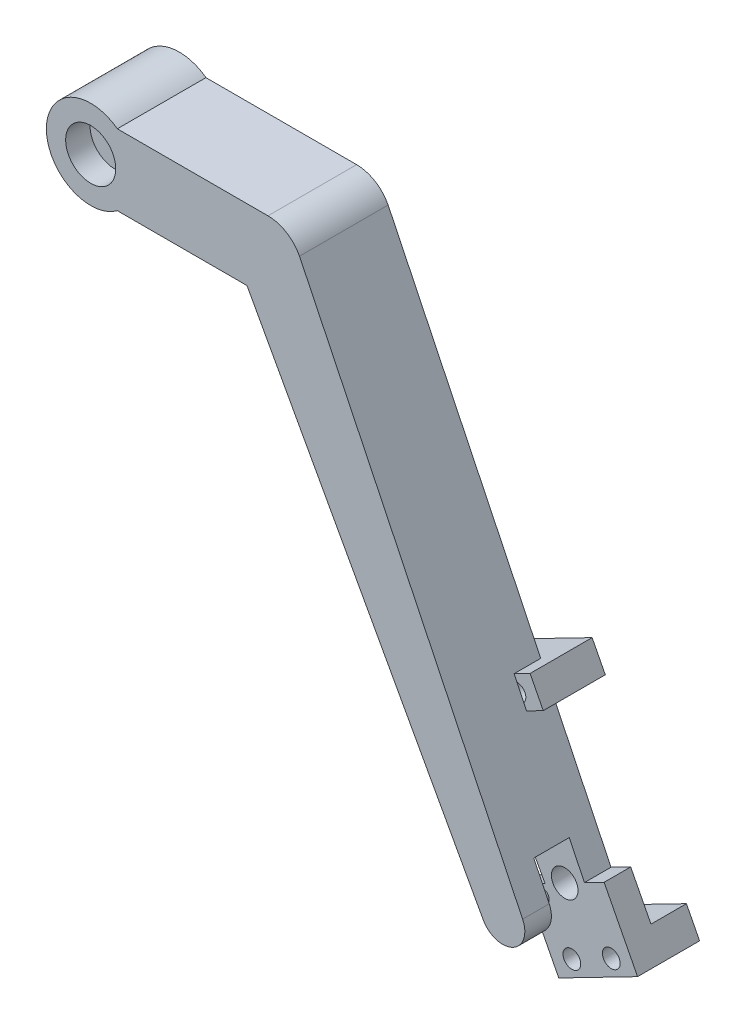
ISO-10303-21;
HEADER;
FILE_DESCRIPTION(('STEP AP214'),'2;1');
FILE_NAME('part.step','',(''),(''),'','','');
FILE_SCHEMA(('AUTOMOTIVE_DESIGN { 1 0 10303 214 1 1 1 1 }'));
ENDSEC;
DATA;
#1=APPLICATION_CONTEXT('core data for automotive mechanical design processes');
#2=APPLICATION_PROTOCOL_DEFINITION('international standard','automotive_design',2000,#1);
#3=PRODUCT_CONTEXT('',#1,'mechanical');
#4=PRODUCT('Part','Part','',(#3));
#5=PRODUCT_RELATED_PRODUCT_CATEGORY('part','',(#4));
#6=PRODUCT_DEFINITION_FORMATION('','',#4);
#7=PRODUCT_DEFINITION_CONTEXT('part definition',#1,'design');
#8=PRODUCT_DEFINITION('design','',#6,#7);
#9=PRODUCT_DEFINITION_SHAPE('','',#8);
#10=(LENGTH_UNIT() NAMED_UNIT(*) SI_UNIT(.MILLI.,.METRE.));
#11=(NAMED_UNIT(*) PLANE_ANGLE_UNIT() SI_UNIT($,.RADIAN.));
#12=(NAMED_UNIT(*) SI_UNIT($,.STERADIAN.) SOLID_ANGLE_UNIT());
#13=UNCERTAINTY_MEASURE_WITH_UNIT(LENGTH_MEASURE(1.E-05),#10,'distance_accuracy_value','');
#14=(GEOMETRIC_REPRESENTATION_CONTEXT(3) GLOBAL_UNCERTAINTY_ASSIGNED_CONTEXT((#13)) GLOBAL_UNIT_ASSIGNED_CONTEXT((#10,
#11,#12)) REPRESENTATION_CONTEXT('',''));
#15=CARTESIAN_POINT('',(0.,0.,0.));
#16=DIRECTION('',(0.,0.,1.));
#17=DIRECTION('',(1.,0.,0.));
#18=AXIS2_PLACEMENT_3D('',#15,#16,#17);
#19=CARTESIAN_POINT('',(39.6538442391268,19.1262088107278,20.));
#20=DIRECTION('',(0.900702995341457,0.434435397018851,0.));
#21=DIRECTION('',(-0.434435397018851,0.900702995341457,0.));
#22=AXIS2_PLACEMENT_3D('',#19,#20,#21);
#23=PLANE('',#22);
#24=DIRECTION('',(0.434435397018853,-0.900702995341457,0.));
#25=VECTOR('',#24,1.);
#26=CARTESIAN_POINT('',(81.5368158168979,-67.708607626347,6.));
#27=LINE('',#26,#25);
#28=CARTESIAN_POINT('',(81.5368158168979,-67.708607626347,6.));
#29=VERTEX_POINT('',#28);
#30=CARTESIAN_POINT('',(82.1753488862775,-69.0324607289288,6.));
#31=VERTEX_POINT('',#30);
#32=EDGE_CURVE('E283',#29,#31,#27,.T.);
#33=ORIENTED_EDGE('',*,*,#32,.F.);
#34=DIRECTION('',(0.,0.,-1.));
#35=VECTOR('',#34,1.);
#36=CARTESIAN_POINT('',(81.5368158168979,-67.708607626347,6.));
#37=LINE('',#36,#35);
#38=CARTESIAN_POINT('',(81.5368158168979,-67.708607626347,0.));
#39=VERTEX_POINT('',#38);
#40=EDGE_CURVE('E268',#29,#39,#37,.T.);
#41=ORIENTED_EDGE('',*,*,#40,.T.);
#42=DIRECTION('',(0.434435397018851,-0.900702995341457,0.));
#43=VECTOR('',#42,1.);
#44=CARTESIAN_POINT('',(39.6538442391268,19.1262088107278,0.));
#45=LINE('',#44,#43);
#46=CARTESIAN_POINT('',(47.1132319912519,3.66086473918818,0.));
#47=VERTEX_POINT('',#46);
#48=EDGE_CURVE('E500',#47,#39,#45,.T.);
#49=ORIENTED_EDGE('',*,*,#48,.F.);
#50=DIRECTION('',(0.,0.,-1.));
#51=VECTOR('',#50,1.);
#52=CARTESIAN_POINT('',(47.1132319912519,3.66086473918818,20.));
#53=LINE('',#52,#51);
#54=CARTESIAN_POINT('',(47.1132319912519,3.66086473918818,20.));
#55=VERTEX_POINT('',#54);
#56=EDGE_CURVE('E539',#55,#47,#53,.T.);
#57=ORIENTED_EDGE('',*,*,#56,.F.);
#58=DIRECTION('',(0.434435397018851,-0.900702995341457,0.));
#59=VECTOR('',#58,1.);
#60=CARTESIAN_POINT('',(39.6538442391268,19.1262088107278,20.));
#61=LINE('',#60,#59);
#62=CARTESIAN_POINT('',(97.4552976747933,-100.711959538007,20.));
#63=VERTEX_POINT('',#62);
#64=EDGE_CURVE('E478',#55,#63,#61,.T.);
#65=ORIENTED_EDGE('',*,*,#64,.T.);
#66=DIRECTION('',(0.,0.,-1.));
#67=VECTOR('',#66,1.);
#68=CARTESIAN_POINT('',(97.4552976747933,-100.711959538007,20.));
#69=LINE('',#68,#67);
#70=CARTESIAN_POINT('',(97.4552976747933,-100.711959538007,14.));
#71=VERTEX_POINT('',#70);
#72=EDGE_CURVE('E56',#63,#71,#69,.T.);
#73=ORIENTED_EDGE('',*,*,#72,.T.);
#74=DIRECTION('',(0.434435397018851,-0.900702995341457,0.));
#75=VECTOR('',#74,1.);
#76=CARTESIAN_POINT('',(97.4552976747933,-100.711959538007,14.));
#77=LINE('',#76,#75);
#78=CARTESIAN_POINT('',(93.9786492075519,-93.5039196092127,14.));
#79=VERTEX_POINT('',#78);
#80=EDGE_CURVE('E442',#79,#71,#77,.T.);
#81=ORIENTED_EDGE('',*,*,#80,.F.);
#82=DIRECTION('',(0.,0.,-1.));
#83=VECTOR('',#82,1.);
#84=CARTESIAN_POINT('',(93.9786492075519,-93.5039196092127,14.));
#85=LINE('',#84,#83);
#86=CARTESIAN_POINT('',(93.9786492075519,-93.5039196092127,6.));
#87=VERTEX_POINT('',#86);
#88=EDGE_CURVE('E454',#79,#87,#85,.T.);
#89=ORIENTED_EDGE('',*,*,#88,.T.);
#90=DIRECTION('',(0.434435397018851,-0.900702995341457,0.));
#91=VECTOR('',#90,1.);
#92=CARTESIAN_POINT('',(97.4552976747933,-100.711959538007,6.));
#93=LINE('',#92,#91);
#94=CARTESIAN_POINT('',(97.399024448687,-100.595289801473,6.));
#95=VERTEX_POINT('',#94);
#96=EDGE_CURVE('E438',#87,#95,#93,.T.);
#97=ORIENTED_EDGE('',*,*,#96,.T.);
#98=DIRECTION('',(0.,0.,1.));
#99=VECTOR('',#98,1.);
#100=CARTESIAN_POINT('',(97.399024448687,-100.595289801473,20.));
#101=LINE('',#100,#99);
#102=CARTESIAN_POINT('',(97.399024448687,-100.595289801473,0.));
#103=VERTEX_POINT('',#102);
#104=EDGE_CURVE('E413',#103,#95,#101,.T.);
#105=ORIENTED_EDGE('',*,*,#104,.F.);
#106=CARTESIAN_POINT('',(84.3615926965316,-73.5651400684927,0.));
#107=VERTEX_POINT('',#106);
#108=EDGE_CURVE('E470',#107,#103,#45,.T.);
#109=ORIENTED_EDGE('',*,*,#108,.F.);
#110=DIRECTION('',(0.,0.,-1.));
#111=VECTOR('',#110,1.);
#112=CARTESIAN_POINT('',(84.3615926965316,-73.5651400684927,6.));
#113=LINE('',#112,#111);
#114=CARTESIAN_POINT('',(84.3615926965316,-73.5651400684927,6.));
#115=VERTEX_POINT('',#114);
#116=EDGE_CURVE('E272',#115,#107,#113,.T.);
#117=ORIENTED_EDGE('',*,*,#116,.F.);
#118=CARTESIAN_POINT('',(83.7425047780747,-72.2816020640845,6.));
#119=VERTEX_POINT('',#118);
#120=EDGE_CURVE('E288',#119,#115,#27,.T.);
#121=ORIENTED_EDGE('',*,*,#120,.F.);
#122=EDGE_CURVE('E287',#31,#119,#27,.T.);
#123=ORIENTED_EDGE('',*,*,#122,.F.);
#124=EDGE_LOOP('',(#33,#41,#49,#57,#65,#73,#81,#89,#97,#105,#109,#117,#121,#123));
#125=FACE_BOUND('',#124,.T.);
#126=ADVANCED_FACE('F47',(#125),#23,.T.);
#127=CARTESIAN_POINT('',(23.7520682877869,13.0126971595974,20.));
#128=DIRECTION('',(0.87700895530545,0.480474028761226,0.));
#129=DIRECTION('',(-0.480474028761226,0.87700895530545,0.));
#130=AXIS2_PLACEMENT_3D('',#127,#128,#129);
#131=PLANE('',#130);
#132=DIRECTION('',(0.,0.,-1.));
#133=VECTOR('',#132,1.);
#134=CARTESIAN_POINT('',(70.9583388766032,-73.1528801135465,6.));
#135=LINE('',#134,#133);
#136=CARTESIAN_POINT('',(70.9583388766032,-73.1528801135465,6.));
#137=VERTEX_POINT('',#136);
#138=CARTESIAN_POINT('',(70.9583388766032,-73.1528801135465,0.));
#139=VERTEX_POINT('',#138);
#140=EDGE_CURVE('E256',#137,#139,#135,.T.);
#141=ORIENTED_EDGE('',*,*,#140,.F.);
#142=DIRECTION('',(-0.480474028761225,0.87700895530545,0.));
#143=VECTOR('',#142,1.);
#144=CARTESIAN_POINT('',(74.0824671981503,-78.8553496571851,6.));
#145=LINE('',#144,#143);
#146=CARTESIAN_POINT('',(71.664539518741,-74.4419077202917,6.));
#147=VERTEX_POINT('',#146);
#148=EDGE_CURVE('E242',#147,#137,#145,.T.);
#149=ORIENTED_EDGE('',*,*,#148,.F.);
#150=CARTESIAN_POINT('',(73.3977723772872,-77.6055766130595,6.));
#151=VERTEX_POINT('',#150);
#152=EDGE_CURVE('E232',#151,#147,#145,.T.);
#153=ORIENTED_EDGE('',*,*,#152,.F.);
#154=CARTESIAN_POINT('',(74.0824671981503,-78.8553496571851,6.));
#155=VERTEX_POINT('',#154);
#156=EDGE_CURVE('E241',#155,#151,#145,.T.);
#157=ORIENTED_EDGE('',*,*,#156,.F.);
#158=DIRECTION('',(0.,0.,-1.));
#159=VECTOR('',#158,1.);
#160=CARTESIAN_POINT('',(74.0824671981503,-78.8553496571851,6.));
#161=LINE('',#160,#159);
#162=CARTESIAN_POINT('',(74.0824671981503,-78.8553496571851,0.));
#163=VERTEX_POINT('',#162);
#164=EDGE_CURVE('E260',#155,#163,#161,.T.);
#165=ORIENTED_EDGE('',*,*,#164,.T.);
#166=DIRECTION('',(0.480474028761226,-0.87700895530545,0.));
#167=VECTOR('',#166,1.);
#168=CARTESIAN_POINT('',(23.7520682877869,13.0126971595974,0.));
#169=LINE('',#168,#167);
#170=CARTESIAN_POINT('',(88.5015209899062,-105.174439858594,0.));
#171=VERTEX_POINT('',#170);
#172=EDGE_CURVE('E518',#163,#171,#169,.T.);
#173=ORIENTED_EDGE('',*,*,#172,.T.);
#174=DIRECTION('',(0.,0.,1.));
#175=VECTOR('',#174,1.);
#176=CARTESIAN_POINT('',(88.5015209899062,-105.174439858594,20.));
#177=LINE('',#176,#175);
#178=CARTESIAN_POINT('',(88.5015209899062,-105.174439858594,6.));
#179=VERTEX_POINT('',#178);
#180=EDGE_CURVE('E399',#171,#179,#177,.T.);
#181=ORIENTED_EDGE('',*,*,#180,.T.);
#182=DIRECTION('',(-0.480474028761225,0.87700895530545,0.));
#183=VECTOR('',#182,1.);
#184=CARTESIAN_POINT('',(84.7186766745936,-98.2696164082836,6.));
#185=LINE('',#184,#183);
#186=CARTESIAN_POINT('',(84.7186766745936,-98.2696164082836,6.));
#187=VERTEX_POINT('',#186);
#188=EDGE_CURVE('E429',#179,#187,#185,.T.);
#189=ORIENTED_EDGE('',*,*,#188,.T.);
#190=DIRECTION('',(0.,0.,-1.));
#191=VECTOR('',#190,1.);
#192=CARTESIAN_POINT('',(84.7186766745936,-98.2696164082836,14.));
#193=LINE('',#192,#191);
#194=CARTESIAN_POINT('',(84.7186766745936,-98.2696164082836,14.));
#195=VERTEX_POINT('',#194);
#196=EDGE_CURVE('E445',#195,#187,#193,.T.);
#197=ORIENTED_EDGE('',*,*,#196,.F.);
#198=DIRECTION('',(-0.480474028761225,0.87700895530545,0.));
#199=VECTOR('',#198,1.);
#200=CARTESIAN_POINT('',(84.7186766745936,-98.2696164082836,14.));
#201=LINE('',#200,#199);
#202=CARTESIAN_POINT('',(88.5637576857285,-105.288040461993,14.));
#203=VERTEX_POINT('',#202);
#204=EDGE_CURVE('E433',#203,#195,#201,.T.);
#205=ORIENTED_EDGE('',*,*,#204,.F.);
#206=DIRECTION('',(0.,0.,-1.));
#207=VECTOR('',#206,1.);
#208=CARTESIAN_POINT('',(88.5637576857285,-105.288040461993,20.));
#209=LINE('',#208,#207);
#210=CARTESIAN_POINT('',(88.5637576857285,-105.288040461993,20.));
#211=VERTEX_POINT('',#210);
#212=EDGE_CURVE('E499',#211,#203,#209,.T.);
#213=ORIENTED_EDGE('',*,*,#212,.F.);
#214=DIRECTION('',(0.480474028761226,-0.87700895530545,0.));
#215=VECTOR('',#214,1.);
#216=CARTESIAN_POINT('',(23.7520682877869,13.0126971595974,20.));
#217=LINE('',#216,#215);
#218=CARTESIAN_POINT('',(35.2639863797693,-8.,20.));
#219=VERTEX_POINT('',#218);
#220=EDGE_CURVE('E496',#219,#211,#217,.T.);
#221=ORIENTED_EDGE('',*,*,#220,.F.);
#222=DIRECTION('',(0.,0.,-1.));
#223=VECTOR('',#222,1.);
#224=CARTESIAN_POINT('',(35.2639863797693,-8.,20.));
#225=LINE('',#224,#223);
#226=CARTESIAN_POINT('',(35.2639863797693,-8.,0.));
#227=VERTEX_POINT('',#226);
#228=EDGE_CURVE('E525',#219,#227,#225,.T.);
#229=ORIENTED_EDGE('',*,*,#228,.T.);
#230=EDGE_CURVE('E479',#227,#139,#169,.T.);
#231=ORIENTED_EDGE('',*,*,#230,.T.);
#232=EDGE_LOOP('',(#141,#149,#153,#157,#165,#173,#181,#189,#197,#205,#213,#221,#229,#231));
#233=FACE_BOUND('',#232,.T.);
#234=ADVANCED_FACE('F240',(#233),#131,.F.);
#235=CARTESIAN_POINT('',(0.,0.,0.));
#236=DIRECTION('',(0.,0.,1.));
#237=DIRECTION('',(1.,0.,0.));
#238=AXIS2_PLACEMENT_3D('',#235,#236,#237);
#239=PLANE('',#238);
#240=DIRECTION('',(0.889153998906481,0.457608092398521,0.));
#241=VECTOR('',#240,1.);
#242=CARTESIAN_POINT('',(67.3560373576858,-75.0068247939319,0.));
#243=LINE('',#242,#241);
#244=EDGE_CURVE('E271',#139,#39,#243,.T.);
#245=ORIENTED_EDGE('',*,*,#244,.F.);
#246=ORIENTED_EDGE('',*,*,#230,.F.);
#247=DIRECTION('',(1.,0.,0.));
#248=VECTOR('',#247,1.);
#249=CARTESIAN_POINT('',(0.,-8.,0.));
#250=LINE('',#249,#248);
#251=CARTESIAN_POINT('',(6.,-8.,0.));
#252=VERTEX_POINT('',#251);
#253=EDGE_CURVE('E515',#252,#227,#250,.T.);
#254=ORIENTED_EDGE('',*,*,#253,.F.);
#255=CARTESIAN_POINT('',(0.,0.,0.));
#256=DIRECTION('',(0.,0.,1.));
#257=DIRECTION('',(1.,0.,0.));
#258=AXIS2_PLACEMENT_3D('',#255,#256,#257);
#259=CIRCLE('',#258,10.);
#260=CARTESIAN_POINT('',(6.,8.,0.));
#261=VERTEX_POINT('',#260);
#262=EDGE_CURVE('E512',#261,#252,#259,.T.);
#263=ORIENTED_EDGE('',*,*,#262,.F.);
#264=DIRECTION('',(1.,0.,0.));
#265=VECTOR('',#264,1.);
#266=CARTESIAN_POINT('',(0.,8.,0.));
#267=LINE('',#266,#265);
#268=CARTESIAN_POINT('',(40.,8.,0.));
#269=VERTEX_POINT('',#268);
#270=EDGE_CURVE('E508',#261,#269,#267,.T.);
#271=ORIENTED_EDGE('',*,*,#270,.T.);
#272=CARTESIAN_POINT('',(40.,0.,0.));
#273=DIRECTION('',(0.,0.,1.));
#274=DIRECTION('',(1.,0.,0.));
#275=AXIS2_PLACEMENT_3D('',#272,#273,#274);
#276=CIRCLE('',#275,8.);
#277=EDGE_CURVE('E504',#47,#269,#276,.T.);
#278=ORIENTED_EDGE('',*,*,#277,.F.);
#279=ORIENTED_EDGE('',*,*,#48,.T.);
#280=EDGE_LOOP('',(#245,#246,#254,#263,#271,#278,#279));
#281=FACE_BOUND('',#280,.T.);
#282=ADVANCED_FACE('F609',(#281),#239,.F.);
#283=CARTESIAN_POINT('',(92.9502727192966,-102.884864830033,0.));
#284=DIRECTION('',(0.,0.,-1.));
#285=DIRECTION('',(-1.,0.,0.));
#286=AXIS2_PLACEMENT_3D('',#283,#284,#285);
#287=CIRCLE('',#286,3.00000000000001);
#288=CARTESIAN_POINT('',(89.9502727192966,-102.884864830033,0.));
#289=VERTEX_POINT('',#288);
#290=EDGE_CURVE('E416',#289,#289,#287,.T.);
#291=ORIENTED_EDGE('',*,*,#290,.F.);
#292=EDGE_LOOP('',(#291));
#293=FACE_BOUND('',#292,.T.);
#294=DIRECTION('',(-0.889153998906481,-0.457608092398521,0.));
#295=VECTOR('',#294,1.);
#296=CARTESIAN_POINT('',(88.1135699364058,-71.6341639388536,0.));
#297=LINE('',#296,#295);
#298=EDGE_CURVE('E995',#107,#163,#297,.T.);
#299=ORIENTED_EDGE('',*,*,#298,.F.);
#300=ORIENTED_EDGE('',*,*,#108,.T.);
#301=DIRECTION('',(0.889153998906481,0.457608092398522,0.));
#302=VECTOR('',#301,1.);
#303=CARTESIAN_POINT('',(95.6177347160161,-101.512040552838,0.));
#304=LINE('',#303,#302);
#305=CARTESIAN_POINT('',(101.841812708361,-98.3087839060481,0.));
#306=VERTEX_POINT('',#305);
#307=EDGE_CURVE('E391',#103,#306,#304,.T.);
#308=ORIENTED_EDGE('',*,*,#307,.T.);
#309=DIRECTION('',(0.457608092398522,-0.889153998906481,0.));
#310=VECTOR('',#309,1.);
#311=CARTESIAN_POINT('',(101.841812708361,-98.3087839060481,0.));
#312=LINE('',#311,#310);
#313=CARTESIAN_POINT('',(106.417893632347,-107.200323895113,0.));
#314=VERTEX_POINT('',#313);
#315=EDGE_CURVE('E370',#306,#314,#312,.T.);
#316=ORIENTED_EDGE('',*,*,#315,.T.);
#317=DIRECTION('',(0.889153998906481,0.457608092398521,0.));
#318=VECTOR('',#317,1.);
#319=CARTESIAN_POINT('',(106.417893632347,-107.200323895113,0.));
#320=LINE('',#319,#318);
#321=CARTESIAN_POINT('',(88.634813654217,-116.352485743083,0.));
#322=VERTEX_POINT('',#321);
#323=EDGE_CURVE('E341',#322,#314,#320,.T.);
#324=ORIENTED_EDGE('',*,*,#323,.F.);
#325=DIRECTION('',(-0.457608092398523,0.88915399890648,0.));
#326=VECTOR('',#325,1.);
#327=CARTESIAN_POINT('',(91.6092662548074,-122.131986735975,0.));
#328=LINE('',#327,#326);
#329=CARTESIAN_POINT('',(84.0587327302318,-107.460945754019,0.));
#330=VERTEX_POINT('',#329);
#331=EDGE_CURVE('E364',#322,#330,#328,.T.);
#332=ORIENTED_EDGE('',*,*,#331,.T.);
#333=DIRECTION('',(0.88915399890648,0.457608092398522,0.));
#334=VECTOR('',#333,1.);
#335=CARTESIAN_POINT('',(84.0587327302318,-107.460945754019,0.));
#336=LINE('',#335,#334);
#337=EDGE_CURVE('E387',#330,#171,#336,.T.);
#338=ORIENTED_EDGE('',*,*,#337,.T.);
#339=ORIENTED_EDGE('',*,*,#172,.F.);
#340=EDGE_LOOP('',(#299,#300,#308,#316,#324,#332,#338,#339));
#341=FACE_BOUND('',#340,.T.);
#342=ADVANCED_FACE('F580',(#293,#341),#239,.F.);
#343=CARTESIAN_POINT('',(92.9502727192966,-102.884864830033,20.));
#344=DIRECTION('',(0.,0.,-1.));
#345=DIRECTION('',(-1.,0.,0.));
#346=AXIS2_PLACEMENT_3D('',#343,#344,#345);
#347=CYLINDRICAL_SURFACE('',#346,5.00167644472953);
#348=ORIENTED_EDGE('',*,*,#212,.T.);
#349=CARTESIAN_POINT('',(92.9502727192966,-102.884864830033,14.));
#350=DIRECTION('',(0.,0.,-1.));
#351=DIRECTION('',(-1.,0.,0.));
#352=AXIS2_PLACEMENT_3D('',#349,#350,#351);
#353=CIRCLE('',#352,5.00167644472953);
#354=EDGE_CURVE('E458',#203,#71,#353,.F.);
#355=ORIENTED_EDGE('',*,*,#354,.T.);
#356=ORIENTED_EDGE('',*,*,#72,.F.);
#357=CARTESIAN_POINT('',(92.9502727192966,-102.884864830033,20.));
#358=DIRECTION('',(0.,0.,1.));
#359=DIRECTION('',(1.,0.,0.));
#360=AXIS2_PLACEMENT_3D('',#357,#358,#359);
#361=CIRCLE('',#360,5.00167644472953);
#362=EDGE_CURVE('E474',#63,#211,#361,.F.);
#363=ORIENTED_EDGE('',*,*,#362,.T.);
#364=EDGE_LOOP('',(#348,#355,#356,#363));
#365=FACE_BOUND('',#364,.T.);
#366=ADVANCED_FACE('F49',(#365),#347,.T.);
#367=CARTESIAN_POINT('',(40.,0.,20.));
#368=DIRECTION('',(0.,0.,-1.));
#369=DIRECTION('',(-1.,0.,0.));
#370=AXIS2_PLACEMENT_3D('',#367,#368,#369);
#371=CYLINDRICAL_SURFACE('',#370,8.);
#372=ORIENTED_EDGE('',*,*,#277,.T.);
#373=DIRECTION('',(0.,0.,-1.));
#374=VECTOR('',#373,1.);
#375=CARTESIAN_POINT('',(40.,8.,20.));
#376=LINE('',#375,#374);
#377=CARTESIAN_POINT('',(40.,8.,20.));
#378=VERTEX_POINT('',#377);
#379=EDGE_CURVE('E536',#378,#269,#376,.T.);
#380=ORIENTED_EDGE('',*,*,#379,.F.);
#381=CARTESIAN_POINT('',(40.,0.,20.));
#382=DIRECTION('',(0.,0.,1.));
#383=DIRECTION('',(1.,0.,0.));
#384=AXIS2_PLACEMENT_3D('',#381,#382,#383);
#385=CIRCLE('',#384,8.);
#386=EDGE_CURVE('E483',#55,#378,#385,.T.);
#387=ORIENTED_EDGE('',*,*,#386,.F.);
#388=ORIENTED_EDGE('',*,*,#56,.T.);
#389=EDGE_LOOP('',(#372,#380,#387,#388));
#390=FACE_BOUND('',#389,.T.);
#391=ADVANCED_FACE('F612',(#390),#371,.T.);
#392=CARTESIAN_POINT('',(0.,8.,20.));
#393=DIRECTION('',(0.,1.,0.));
#394=DIRECTION('',(0.,0.,1.));
#395=AXIS2_PLACEMENT_3D('',#392,#393,#394);
#396=PLANE('',#395);
#397=ORIENTED_EDGE('',*,*,#270,.F.);
#398=DIRECTION('',(0.,0.,-1.));
#399=VECTOR('',#398,1.);
#400=CARTESIAN_POINT('',(6.,8.,20.));
#401=LINE('',#400,#399);
#402=CARTESIAN_POINT('',(6.,8.,20.));
#403=VERTEX_POINT('',#402);
#404=EDGE_CURVE('E533',#403,#261,#401,.T.);
#405=ORIENTED_EDGE('',*,*,#404,.F.);
#406=DIRECTION('',(1.,0.,0.));
#407=VECTOR('',#406,1.);
#408=CARTESIAN_POINT('',(0.,8.,20.));
#409=LINE('',#408,#407);
#410=EDGE_CURVE('E486',#403,#378,#409,.T.);
#411=ORIENTED_EDGE('',*,*,#410,.T.);
#412=ORIENTED_EDGE('',*,*,#379,.T.);
#413=EDGE_LOOP('',(#397,#405,#411,#412));
#414=FACE_BOUND('',#413,.T.);
#415=ADVANCED_FACE('F615',(#414),#396,.T.);
#416=CARTESIAN_POINT('',(0.,0.,20.));
#417=DIRECTION('',(0.,0.,-1.));
#418=DIRECTION('',(-1.,0.,0.));
#419=AXIS2_PLACEMENT_3D('',#416,#417,#418);
#420=CYLINDRICAL_SURFACE('',#419,10.);
#421=ORIENTED_EDGE('',*,*,#262,.T.);
#422=DIRECTION('',(0.,0.,-1.));
#423=VECTOR('',#422,1.);
#424=CARTESIAN_POINT('',(6.,-8.,20.));
#425=LINE('',#424,#423);
#426=CARTESIAN_POINT('',(6.,-8.,20.));
#427=VERTEX_POINT('',#426);
#428=EDGE_CURVE('E529',#427,#252,#425,.T.);
#429=ORIENTED_EDGE('',*,*,#428,.F.);
#430=CARTESIAN_POINT('',(0.,0.,20.));
#431=DIRECTION('',(0.,0.,1.));
#432=DIRECTION('',(1.,0.,0.));
#433=AXIS2_PLACEMENT_3D('',#430,#431,#432);
#434=CIRCLE('',#433,10.);
#435=EDGE_CURVE('E490',#403,#427,#434,.T.);
#436=ORIENTED_EDGE('',*,*,#435,.F.);
#437=ORIENTED_EDGE('',*,*,#404,.T.);
#438=EDGE_LOOP('',(#421,#429,#436,#437));
#439=FACE_BOUND('',#438,.T.);
#440=ADVANCED_FACE('F619',(#439),#420,.T.);
#441=CARTESIAN_POINT('',(0.,-8.,20.));
#442=DIRECTION('',(0.,1.,0.));
#443=DIRECTION('',(-1.,0.,0.));
#444=AXIS2_PLACEMENT_3D('',#441,#442,#443);
#445=PLANE('',#444);
#446=ORIENTED_EDGE('',*,*,#253,.T.);
#447=ORIENTED_EDGE('',*,*,#228,.F.);
#448=DIRECTION('',(1.,0.,0.));
#449=VECTOR('',#448,1.);
#450=CARTESIAN_POINT('',(0.,-8.,20.));
#451=LINE('',#450,#449);
#452=EDGE_CURVE('E493',#427,#219,#451,.T.);
#453=ORIENTED_EDGE('',*,*,#452,.F.);
#454=ORIENTED_EDGE('',*,*,#428,.T.);
#455=EDGE_LOOP('',(#446,#447,#453,#454));
#456=FACE_BOUND('',#455,.T.);
#457=ADVANCED_FACE('F623',(#456),#445,.F.);
#458=CARTESIAN_POINT('',(0.,0.,20.));
#459=DIRECTION('',(0.,0.,1.));
#460=DIRECTION('',(1.,0.,0.));
#461=AXIS2_PLACEMENT_3D('',#458,#459,#460);
#462=PLANE('',#461);
#463=CARTESIAN_POINT('',(0.,0.,20.));
#464=DIRECTION('',(0.,0.,1.));
#465=DIRECTION('',(1.,0.,0.));
#466=AXIS2_PLACEMENT_3D('',#463,#464,#465);
#467=CIRCLE('',#466,5.65);
#468=CARTESIAN_POINT('',(5.65,0.,20.));
#469=VERTEX_POINT('',#468);
#470=EDGE_CURVE('E465',#469,#469,#467,.T.);
#471=ORIENTED_EDGE('',*,*,#470,.F.);
#472=EDGE_LOOP('',(#471));
#473=FACE_BOUND('',#472,.T.);
#474=ORIENTED_EDGE('',*,*,#362,.F.);
#475=ORIENTED_EDGE('',*,*,#64,.F.);
#476=ORIENTED_EDGE('',*,*,#386,.T.);
#477=ORIENTED_EDGE('',*,*,#410,.F.);
#478=ORIENTED_EDGE('',*,*,#435,.T.);
#479=ORIENTED_EDGE('',*,*,#452,.T.);
#480=ORIENTED_EDGE('',*,*,#220,.T.);
#481=EDGE_LOOP('',(#474,#475,#476,#477,#478,#479,#480));
#482=FACE_BOUND('',#481,.T.);
#483=ADVANCED_FACE('F550',(#473,#482),#462,.T.);
#484=CARTESIAN_POINT('',(0.,0.,14.5));
#485=DIRECTION('',(0.,0.,1.));
#486=DIRECTION('',(1.,0.,0.));
#487=AXIS2_PLACEMENT_3D('',#484,#485,#486);
#488=CYLINDRICAL_SURFACE('',#487,5.65);
#489=CARTESIAN_POINT('',(0.,0.,14.5));
#490=DIRECTION('',(0.,0.,1.));
#491=DIRECTION('',(1.,0.,0.));
#492=AXIS2_PLACEMENT_3D('',#489,#490,#491);
#493=CIRCLE('',#492,5.65);
#494=CARTESIAN_POINT('',(5.65,0.,14.5));
#495=VERTEX_POINT('',#494);
#496=EDGE_CURVE('E466',#495,#495,#493,.T.);
#497=ORIENTED_EDGE('',*,*,#496,.F.);
#498=EDGE_LOOP('',(#497));
#499=FACE_BOUND('',#498,.T.);
#500=ORIENTED_EDGE('',*,*,#470,.T.);
#501=EDGE_LOOP('',(#500));
#502=FACE_BOUND('',#501,.T.);
#503=ADVANCED_FACE('F633',(#499,#502),#488,.F.);
#504=CARTESIAN_POINT('',(0.,0.,14.5));
#505=DIRECTION('',(0.,0.,1.));
#506=DIRECTION('',(1.,0.,0.));
#507=AXIS2_PLACEMENT_3D('',#504,#505,#506);
#508=PLANE('',#507);
#509=ORIENTED_EDGE('',*,*,#496,.T.);
#510=EDGE_LOOP('',(#509));
#511=FACE_BOUND('',#510,.T.);
#512=ADVANCED_FACE('F637',(#511),#508,.T.);
#513=CARTESIAN_POINT('',(93.9786492075519,-93.5039196092127,14.));
#514=DIRECTION('',(-0.457608092398519,0.889153998906482,0.));
#515=DIRECTION('',(-0.889153998906482,-0.457608092398519,0.));
#516=AXIS2_PLACEMENT_3D('',#513,#514,#515);
#517=PLANE('',#516);
#518=DIRECTION('',(0.889153998906482,0.457608092398519,0.));
#519=VECTOR('',#518,1.);
#520=CARTESIAN_POINT('',(93.9786492075519,-93.5039196092127,6.));
#521=LINE('',#520,#519);
#522=EDGE_CURVE('E448',#187,#87,#521,.T.);
#523=ORIENTED_EDGE('',*,*,#522,.T.);
#524=ORIENTED_EDGE('',*,*,#88,.F.);
#525=DIRECTION('',(0.889153998906482,0.457608092398519,0.));
#526=VECTOR('',#525,1.);
#527=CARTESIAN_POINT('',(93.9786492075519,-93.5039196092127,14.));
#528=LINE('',#527,#526);
#529=EDGE_CURVE('E437',#195,#79,#528,.T.);
#530=ORIENTED_EDGE('',*,*,#529,.F.);
#531=ORIENTED_EDGE('',*,*,#196,.T.);
#532=EDGE_LOOP('',(#523,#524,#530,#531));
#533=FACE_BOUND('',#532,.T.);
#534=ADVANCED_FACE('F560',(#533),#517,.F.);
#535=CARTESIAN_POINT('',(93.0095276802609,-103.,14.));
#536=DIRECTION('',(0.,0.,-1.));
#537=DIRECTION('',(-1.,0.,0.));
#538=AXIS2_PLACEMENT_3D('',#535,#536,#537);
#539=PLANE('',#538);
#540=CARTESIAN_POINT('',(92.9502727192966,-102.884864830033,14.));
#541=DIRECTION('',(0.,0.,1.));
#542=DIRECTION('',(1.,0.,0.));
#543=AXIS2_PLACEMENT_3D('',#540,#541,#542);
#544=CIRCLE('',#543,1.5);
#545=CARTESIAN_POINT('',(94.4502727192966,-102.884864830033,14.));
#546=VERTEX_POINT('',#545);
#547=EDGE_CURVE('E425',#546,#546,#544,.T.);
#548=ORIENTED_EDGE('',*,*,#547,.T.);
#549=EDGE_LOOP('',(#548));
#550=FACE_BOUND('',#549,.T.);
#551=ORIENTED_EDGE('',*,*,#204,.T.);
#552=ORIENTED_EDGE('',*,*,#529,.T.);
#553=ORIENTED_EDGE('',*,*,#80,.T.);
#554=ORIENTED_EDGE('',*,*,#354,.F.);
#555=EDGE_LOOP('',(#551,#552,#553,#554));
#556=FACE_BOUND('',#555,.T.);
#557=ADVANCED_FACE('F558',(#550,#556),#539,.T.);
#558=CARTESIAN_POINT('',(93.0095276802609,-103.,6.));
#559=DIRECTION('',(0.,0.,-1.));
#560=DIRECTION('',(-1.,0.,0.));
#561=AXIS2_PLACEMENT_3D('',#558,#559,#560);
#562=PLANE('',#561);
#563=CARTESIAN_POINT('',(103.459349938109,-112.378114853552,6.));
#564=DIRECTION('',(0.,0.,-1.));
#565=DIRECTION('',(-1.,0.,0.));
#566=AXIS2_PLACEMENT_3D('',#563,#564,#565);
#567=CIRCLE('',#566,2.);
#568=CARTESIAN_POINT('',(101.459349938109,-112.378114853552,6.));
#569=VERTEX_POINT('',#568);
#570=EDGE_CURVE('E265',#569,#569,#567,.F.);
#571=ORIENTED_EDGE('',*,*,#570,.F.);
#572=EDGE_LOOP('',(#571));
#573=FACE_BOUND('',#572,.T.);
#574=CARTESIAN_POINT('',(94.5678099490446,-116.954195777537,6.));
#575=DIRECTION('',(0.,0.,-1.));
#576=DIRECTION('',(-1.,0.,0.));
#577=AXIS2_PLACEMENT_3D('',#574,#575,#576);
#578=CIRCLE('',#577,2.);
#579=CARTESIAN_POINT('',(92.5678099490446,-116.954195777537,6.));
#580=VERTEX_POINT('',#579);
#581=EDGE_CURVE('E301',#580,#580,#578,.F.);
#582=ORIENTED_EDGE('',*,*,#581,.F.);
#583=EDGE_LOOP('',(#582));
#584=FACE_BOUND('',#583,.T.);
#585=DIRECTION('',(0.889153998906481,0.457608092398522,0.));
#586=VECTOR('',#585,1.);
#587=CARTESIAN_POINT('',(95.6177347160161,-101.512040552838,6.));
#588=LINE('',#587,#586);
#589=CARTESIAN_POINT('',(101.841812708361,-98.3087839060481,6.));
#590=VERTEX_POINT('',#589);
#591=EDGE_CURVE('E373',#95,#590,#588,.T.);
#592=ORIENTED_EDGE('',*,*,#591,.F.);
#593=ORIENTED_EDGE('',*,*,#96,.F.);
#594=ORIENTED_EDGE('',*,*,#522,.F.);
#595=ORIENTED_EDGE('',*,*,#188,.F.);
#596=DIRECTION('',(0.88915399890648,0.457608092398522,0.));
#597=VECTOR('',#596,1.);
#598=CARTESIAN_POINT('',(84.0587327302318,-107.460945754019,6.));
#599=LINE('',#598,#597);
#600=CARTESIAN_POINT('',(84.0587327302318,-107.460945754019,6.));
#601=VERTEX_POINT('',#600);
#602=EDGE_CURVE('E369',#601,#179,#599,.T.);
#603=ORIENTED_EDGE('',*,*,#602,.F.);
#604=DIRECTION('',(-0.457608092398523,0.88915399890648,0.));
#605=VECTOR('',#604,1.);
#606=CARTESIAN_POINT('',(91.6092662548074,-122.131986735975,6.));
#607=LINE('',#606,#605);
#608=CARTESIAN_POINT('',(91.6092662548074,-122.131986735975,6.));
#609=VERTEX_POINT('',#608);
#610=EDGE_CURVE('E365',#609,#601,#607,.T.);
#611=ORIENTED_EDGE('',*,*,#610,.F.);
#612=DIRECTION('',(-0.889153998906481,-0.457608092398522,0.));
#613=VECTOR('',#612,1.);
#614=CARTESIAN_POINT('',(109.392346232937,-112.979824888005,6.));
#615=LINE('',#614,#613);
#616=CARTESIAN_POINT('',(109.392346232937,-112.979824888005,6.));
#617=VERTEX_POINT('',#616);
#618=EDGE_CURVE('E380',#617,#609,#615,.T.);
#619=ORIENTED_EDGE('',*,*,#618,.F.);
#620=DIRECTION('',(0.457608092398522,-0.889153998906481,0.));
#621=VECTOR('',#620,1.);
#622=CARTESIAN_POINT('',(101.841812708361,-98.3087839060481,6.));
#623=LINE('',#622,#621);
#624=EDGE_CURVE('E376',#590,#617,#623,.T.);
#625=ORIENTED_EDGE('',*,*,#624,.F.);
#626=EDGE_LOOP('',(#592,#593,#594,#595,#603,#611,#619,#625));
#627=FACE_BOUND('',#626,.T.);
#628=CARTESIAN_POINT('',(92.9502727192966,-102.884864830033,6.));
#629=DIRECTION('',(0.,0.,-1.));
#630=DIRECTION('',(-1.,0.,0.));
#631=AXIS2_PLACEMENT_3D('',#628,#629,#630);
#632=CIRCLE('',#631,3.00000000000001);
#633=CARTESIAN_POINT('',(89.9502727192966,-102.884864830033,6.));
#634=VERTEX_POINT('',#633);
#635=EDGE_CURVE('E420',#634,#634,#632,.F.);
#636=ORIENTED_EDGE('',*,*,#635,.F.);
#637=EDGE_LOOP('',(#636));
#638=FACE_BOUND('',#637,.T.);
#639=ADVANCED_FACE('F567',(#573,#584,#627,#638),#562,.F.);
#640=CARTESIAN_POINT('',(92.9502727192966,-102.884864830033,14.));
#641=DIRECTION('',(0.,0.,-1.));
#642=DIRECTION('',(-1.,0.,0.));
#643=AXIS2_PLACEMENT_3D('',#640,#641,#642);
#644=CYLINDRICAL_SURFACE('',#643,1.5);
#645=ORIENTED_EDGE('',*,*,#547,.F.);
#646=EDGE_LOOP('',(#645));
#647=FACE_BOUND('',#646,.T.);
#648=CARTESIAN_POINT('',(92.9502727192966,-102.884864830033,11.));
#649=DIRECTION('',(0.,0.,1.));
#650=DIRECTION('',(1.,0.,0.));
#651=AXIS2_PLACEMENT_3D('',#648,#649,#650);
#652=CIRCLE('',#651,1.5);
#653=CARTESIAN_POINT('',(94.4502727192966,-102.884864830033,11.));
#654=VERTEX_POINT('',#653);
#655=EDGE_CURVE('E424',#654,#654,#652,.T.);
#656=ORIENTED_EDGE('',*,*,#655,.T.);
#657=EDGE_LOOP('',(#656));
#658=FACE_BOUND('',#657,.T.);
#659=ADVANCED_FACE('F646',(#647,#658),#644,.T.);
#660=CARTESIAN_POINT('',(92.9502727192966,-102.884864830033,11.));
#661=DIRECTION('',(0.,0.,1.));
#662=DIRECTION('',(1.,0.,0.));
#663=AXIS2_PLACEMENT_3D('',#660,#661,#662);
#664=PLANE('',#663);
#665=ORIENTED_EDGE('',*,*,#655,.F.);
#666=EDGE_LOOP('',(#665));
#667=FACE_BOUND('',#666,.T.);
#668=ADVANCED_FACE('F653',(#667),#664,.F.);
#669=CARTESIAN_POINT('',(92.9502727192966,-102.884864830033,20.001));
#670=DIRECTION('',(0.,0.,-1.));
#671=DIRECTION('',(-1.,0.,0.));
#672=AXIS2_PLACEMENT_3D('',#669,#670,#671);
#673=CYLINDRICAL_SURFACE('',#672,3.00000000000001);
#674=ORIENTED_EDGE('',*,*,#635,.T.);
#675=EDGE_LOOP('',(#674));
#676=FACE_BOUND('',#675,.T.);
#677=ORIENTED_EDGE('',*,*,#290,.T.);
#678=EDGE_LOOP('',(#677));
#679=FACE_BOUND('',#678,.T.);
#680=ADVANCED_FACE('F657',(#676,#679),#673,.F.);
#681=CARTESIAN_POINT('',(84.0587327302318,-107.460945754019,6.));
#682=DIRECTION('',(-0.457608092398522,0.889153998906481,0.));
#683=DIRECTION('',(-0.889153998906481,-0.457608092398522,0.));
#684=AXIS2_PLACEMENT_3D('',#681,#682,#683);
#685=PLANE('',#684);
#686=ORIENTED_EDGE('',*,*,#180,.F.);
#687=ORIENTED_EDGE('',*,*,#337,.F.);
#688=DIRECTION('',(0.,0.,-1.));
#689=VECTOR('',#688,1.);
#690=CARTESIAN_POINT('',(84.0587327302318,-107.460945754019,6.));
#691=LINE('',#690,#689);
#692=EDGE_CURVE('E384',#601,#330,#691,.T.);
#693=ORIENTED_EDGE('',*,*,#692,.F.);
#694=ORIENTED_EDGE('',*,*,#602,.T.);
#695=EDGE_LOOP('',(#686,#687,#693,#694));
#696=FACE_BOUND('',#695,.T.);
#697=ADVANCED_FACE('F590',(#696),#685,.T.);
#698=CARTESIAN_POINT('',(91.6092662548074,-122.131986735975,6.));
#699=DIRECTION('',(-0.88915399890648,-0.457608092398523,0.));
#700=DIRECTION('',(0.457608092398523,-0.88915399890648,0.));
#701=AXIS2_PLACEMENT_3D('',#698,#699,#700);
#702=PLANE('',#701);
#703=ORIENTED_EDGE('',*,*,#331,.F.);
#704=DIRECTION('',(0.,0.,1.));
#705=VECTOR('',#704,1.);
#706=CARTESIAN_POINT('',(88.634813654217,-116.352485743083,-8.));
#707=LINE('',#706,#705);
#708=CARTESIAN_POINT('',(88.634813654217,-116.352485743083,-8.));
#709=VERTEX_POINT('',#708);
#710=EDGE_CURVE('E360',#709,#322,#707,.T.);
#711=ORIENTED_EDGE('',*,*,#710,.F.);
#712=DIRECTION('',(-0.457608092398523,0.88915399890648,0.));
#713=VECTOR('',#712,1.);
#714=CARTESIAN_POINT('',(91.6092662548074,-122.131986735975,-8.));
#715=LINE('',#714,#713);
#716=CARTESIAN_POINT('',(91.6092662548074,-122.131986735975,-8.));
#717=VERTEX_POINT('',#716);
#718=EDGE_CURVE('E345',#717,#709,#715,.T.);
#719=ORIENTED_EDGE('',*,*,#718,.F.);
#720=DIRECTION('',(0.,0.,-1.));
#721=VECTOR('',#720,1.);
#722=CARTESIAN_POINT('',(91.6092662548074,-122.131986735975,6.));
#723=LINE('',#722,#721);
#724=EDGE_CURVE('E396',#609,#717,#723,.T.);
#725=ORIENTED_EDGE('',*,*,#724,.F.);
#726=ORIENTED_EDGE('',*,*,#610,.T.);
#727=ORIENTED_EDGE('',*,*,#692,.T.);
#728=EDGE_LOOP('',(#703,#711,#719,#725,#726,#727));
#729=FACE_BOUND('',#728,.T.);
#730=ADVANCED_FACE('F585',(#729),#702,.T.);
#731=CARTESIAN_POINT('',(109.392346232937,-112.979824888005,6.));
#732=DIRECTION('',(0.457608092398522,-0.889153998906481,0.));
#733=DIRECTION('',(0.889153998906481,0.457608092398522,0.));
#734=AXIS2_PLACEMENT_3D('',#731,#732,#733);
#735=PLANE('',#734);
#736=ORIENTED_EDGE('',*,*,#724,.T.);
#737=DIRECTION('',(-0.889153998906481,-0.457608092398521,0.));
#738=VECTOR('',#737,1.);
#739=CARTESIAN_POINT('',(109.392346232937,-112.979824888005,-8.));
#740=LINE('',#739,#738);
#741=CARTESIAN_POINT('',(109.392346232937,-112.979824888005,-8.));
#742=VERTEX_POINT('',#741);
#743=EDGE_CURVE('E333',#742,#717,#740,.T.);
#744=ORIENTED_EDGE('',*,*,#743,.F.);
#745=DIRECTION('',(0.,0.,-1.));
#746=VECTOR('',#745,1.);
#747=CARTESIAN_POINT('',(109.392346232937,-112.979824888005,6.));
#748=LINE('',#747,#746);
#749=EDGE_CURVE('E400',#617,#742,#748,.T.);
#750=ORIENTED_EDGE('',*,*,#749,.F.);
#751=ORIENTED_EDGE('',*,*,#618,.T.);
#752=EDGE_LOOP('',(#736,#744,#750,#751));
#753=FACE_BOUND('',#752,.T.);
#754=ADVANCED_FACE('F594',(#753),#735,.T.);
#755=CARTESIAN_POINT('',(101.841812708361,-98.3087839060481,6.));
#756=DIRECTION('',(0.889153998906481,0.457608092398522,0.));
#757=DIRECTION('',(-0.457608092398522,0.889153998906481,0.));
#758=AXIS2_PLACEMENT_3D('',#755,#756,#757);
#759=PLANE('',#758);
#760=ORIENTED_EDGE('',*,*,#315,.F.);
#761=DIRECTION('',(0.,0.,-1.));
#762=VECTOR('',#761,1.);
#763=CARTESIAN_POINT('',(101.841812708361,-98.3087839060481,6.));
#764=LINE('',#763,#762);
#765=EDGE_CURVE('E403',#590,#306,#764,.T.);
#766=ORIENTED_EDGE('',*,*,#765,.F.);
#767=ORIENTED_EDGE('',*,*,#624,.T.);
#768=ORIENTED_EDGE('',*,*,#749,.T.);
#769=DIRECTION('',(0.457608092398523,-0.88915399890648,0.));
#770=VECTOR('',#769,1.);
#771=CARTESIAN_POINT('',(106.417893632347,-107.200323895113,-8.));
#772=LINE('',#771,#770);
#773=CARTESIAN_POINT('',(106.417893632347,-107.200323895113,-8.));
#774=VERTEX_POINT('',#773);
#775=EDGE_CURVE('E331',#774,#742,#772,.T.);
#776=ORIENTED_EDGE('',*,*,#775,.F.);
#777=DIRECTION('',(0.,0.,1.));
#778=VECTOR('',#777,1.);
#779=CARTESIAN_POINT('',(106.417893632347,-107.200323895113,-8.));
#780=LINE('',#779,#778);
#781=EDGE_CURVE('E356',#774,#314,#780,.T.);
#782=ORIENTED_EDGE('',*,*,#781,.T.);
#783=EDGE_LOOP('',(#760,#766,#767,#768,#776,#782));
#784=FACE_BOUND('',#783,.T.);
#785=ADVANCED_FACE('F577',(#784),#759,.T.);
#786=CARTESIAN_POINT('',(95.6177347160161,-101.512040552838,6.));
#787=DIRECTION('',(-0.457608092398521,0.889153998906481,0.));
#788=DIRECTION('',(-0.889153998906481,-0.457608092398522,0.));
#789=AXIS2_PLACEMENT_3D('',#786,#787,#788);
#790=PLANE('',#789);
#791=ORIENTED_EDGE('',*,*,#307,.F.);
#792=ORIENTED_EDGE('',*,*,#104,.T.);
#793=ORIENTED_EDGE('',*,*,#591,.T.);
#794=ORIENTED_EDGE('',*,*,#765,.T.);
#795=EDGE_LOOP('',(#791,#792,#793,#794));
#796=FACE_BOUND('',#795,.T.);
#797=ADVANCED_FACE('F575',(#796),#790,.T.);
#798=CARTESIAN_POINT('',(106.417893632347,-107.200323895113,-8.));
#799=DIRECTION('',(0.457608092398521,-0.889153998906481,0.));
#800=DIRECTION('',(0.889153998906481,0.457608092398521,0.));
#801=AXIS2_PLACEMENT_3D('',#798,#799,#800);
#802=PLANE('',#801);
#803=ORIENTED_EDGE('',*,*,#323,.T.);
#804=ORIENTED_EDGE('',*,*,#781,.F.);
#805=DIRECTION('',(0.889153998906481,0.457608092398521,0.));
#806=VECTOR('',#805,1.);
#807=CARTESIAN_POINT('',(106.417893632347,-107.200323895113,-8.));
#808=LINE('',#807,#806);
#809=EDGE_CURVE('E336',#709,#774,#808,.T.);
#810=ORIENTED_EDGE('',*,*,#809,.F.);
#811=ORIENTED_EDGE('',*,*,#710,.T.);
#812=EDGE_LOOP('',(#803,#804,#810,#811));
#813=FACE_BOUND('',#812,.T.);
#814=ADVANCED_FACE('F324',(#813),#802,.F.);
#815=CARTESIAN_POINT('',(0.,0.,-8.));
#816=DIRECTION('',(0.,0.,-1.));
#817=DIRECTION('',(-1.,0.,0.));
#818=AXIS2_PLACEMENT_3D('',#815,#816,#817);
#819=PLANE('',#818);
#820=CARTESIAN_POINT('',(103.459349938109,-112.378114853552,-8.));
#821=DIRECTION('',(0.,0.,-1.));
#822=DIRECTION('',(-1.,0.,0.));
#823=AXIS2_PLACEMENT_3D('',#820,#821,#822);
#824=CIRCLE('',#823,2.);
#825=CARTESIAN_POINT('',(101.459349938109,-112.378114853552,-8.));
#826=VERTEX_POINT('',#825);
#827=EDGE_CURVE('E307',#826,#826,#824,.T.);
#828=ORIENTED_EDGE('',*,*,#827,.F.);
#829=EDGE_LOOP('',(#828));
#830=FACE_BOUND('',#829,.T.);
#831=CARTESIAN_POINT('',(94.5678099490446,-116.954195777537,-8.));
#832=DIRECTION('',(0.,0.,-1.));
#833=DIRECTION('',(1.,0.,0.));
#834=AXIS2_PLACEMENT_3D('',#831,#832,#833);
#835=CIRCLE('',#834,2.);
#836=CARTESIAN_POINT('',(96.5678099490447,-116.954195777537,-8.));
#837=VERTEX_POINT('',#836);
#838=EDGE_CURVE('E303',#837,#837,#835,.T.);
#839=ORIENTED_EDGE('',*,*,#838,.F.);
#840=EDGE_LOOP('',(#839));
#841=FACE_BOUND('',#840,.T.);
#842=ORIENTED_EDGE('',*,*,#775,.T.);
#843=ORIENTED_EDGE('',*,*,#743,.T.);
#844=ORIENTED_EDGE('',*,*,#718,.T.);
#845=ORIENTED_EDGE('',*,*,#809,.T.);
#846=EDGE_LOOP('',(#842,#843,#844,#845));
#847=FACE_BOUND('',#846,.T.);
#848=ADVANCED_FACE('F320',(#830,#841,#847),#819,.T.);
#849=CARTESIAN_POINT('',(70.3304899582762,-80.7863257868241,-8.));
#850=DIRECTION('',(0.889153998906482,0.457608092398519,0.));
#851=DIRECTION('',(-0.457608092398519,0.889153998906482,0.));
#852=AXIS2_PLACEMENT_3D('',#849,#850,#851);
#853=PLANE('',#852);
#854=DIRECTION('',(0.,0.,1.));
#855=VECTOR('',#854,1.);
#856=CARTESIAN_POINT('',(70.3304899582762,-80.7863257868241,-8.));
#857=LINE('',#856,#855);
#858=CARTESIAN_POINT('',(70.3304899582762,-80.7863257868241,-8.));
#859=VERTEX_POINT('',#858);
#860=CARTESIAN_POINT('',(70.3304899582762,-80.7863257868241,6.));
#861=VERTEX_POINT('',#860);
#862=EDGE_CURVE('E1005',#859,#861,#857,.T.);
#863=ORIENTED_EDGE('',*,*,#862,.T.);
#864=DIRECTION('',(0.457608092398519,-0.889153998906483,0.));
#865=VECTOR('',#864,1.);
#866=CARTESIAN_POINT('',(67.3560373576858,-75.0068247939319,6.));
#867=LINE('',#866,#865);
#868=CARTESIAN_POINT('',(67.3560373576858,-75.0068247939319,6.));
#869=VERTEX_POINT('',#868);
#870=EDGE_CURVE('E252',#869,#861,#867,.T.);
#871=ORIENTED_EDGE('',*,*,#870,.F.);
#872=DIRECTION('',(0.,0.,1.));
#873=VECTOR('',#872,1.);
#874=CARTESIAN_POINT('',(67.3560373576858,-75.0068247939319,-8.));
#875=LINE('',#874,#873);
#876=CARTESIAN_POINT('',(67.3560373576858,-75.0068247939319,-8.));
#877=VERTEX_POINT('',#876);
#878=EDGE_CURVE('E348',#877,#869,#875,.T.);
#879=ORIENTED_EDGE('',*,*,#878,.F.);
#880=DIRECTION('',(-0.457608092398519,0.889153998906483,0.));
#881=VECTOR('',#880,1.);
#882=CARTESIAN_POINT('',(70.3304899582762,-80.7863257868241,-8.));
#883=LINE('',#882,#881);
#884=EDGE_CURVE('E987',#859,#877,#883,.T.);
#885=ORIENTED_EDGE('',*,*,#884,.F.);
#886=EDGE_LOOP('',(#863,#871,#879,#885));
#887=FACE_BOUND('',#886,.T.);
#888=ADVANCED_FACE('F323',(#887),#853,.F.);
#889=CARTESIAN_POINT('',(67.3560373576858,-75.0068247939319,-8.));
#890=DIRECTION('',(0.457608092398521,-0.889153998906481,0.));
#891=DIRECTION('',(0.889153998906481,0.457608092398521,0.));
#892=AXIS2_PLACEMENT_3D('',#889,#890,#891);
#893=PLANE('',#892);
#894=ORIENTED_EDGE('',*,*,#878,.T.);
#895=DIRECTION('',(-0.889153998906482,-0.457608092398518,0.));
#896=VECTOR('',#895,1.);
#897=CARTESIAN_POINT('',(70.9583388766032,-73.1528801135465,6.));
#898=LINE('',#897,#896);
#899=EDGE_CURVE('E292',#137,#869,#898,.T.);
#900=ORIENTED_EDGE('',*,*,#899,.F.);
#901=ORIENTED_EDGE('',*,*,#140,.T.);
#902=ORIENTED_EDGE('',*,*,#244,.T.);
#903=ORIENTED_EDGE('',*,*,#40,.F.);
#904=DIRECTION('',(-0.889153998906481,-0.457608092398521,0.));
#905=VECTOR('',#904,1.);
#906=CARTESIAN_POINT('',(85.1391173358154,-65.8546629459615,6.));
#907=LINE('',#906,#905);
#908=CARTESIAN_POINT('',(85.1391173358154,-65.8546629459615,6.));
#909=VERTEX_POINT('',#908);
#910=EDGE_CURVE('E289',#909,#29,#907,.T.);
#911=ORIENTED_EDGE('',*,*,#910,.F.);
#912=DIRECTION('',(0.,0.,1.));
#913=VECTOR('',#912,1.);
#914=CARTESIAN_POINT('',(85.1391173358154,-65.8546629459615,-8.));
#915=LINE('',#914,#913);
#916=CARTESIAN_POINT('',(85.1391173358154,-65.8546629459615,-8.));
#917=VERTEX_POINT('',#916);
#918=EDGE_CURVE('E999',#917,#909,#915,.T.);
#919=ORIENTED_EDGE('',*,*,#918,.F.);
#920=DIRECTION('',(0.889153998906481,0.457608092398521,0.));
#921=VECTOR('',#920,1.);
#922=CARTESIAN_POINT('',(67.3560373576858,-75.0068247939319,-8.));
#923=LINE('',#922,#921);
#924=EDGE_CURVE('E989',#877,#917,#923,.T.);
#925=ORIENTED_EDGE('',*,*,#924,.F.);
#926=EDGE_LOOP('',(#894,#900,#901,#902,#903,#911,#919,#925));
#927=FACE_BOUND('',#926,.T.);
#928=ADVANCED_FACE('F673',(#927),#893,.F.);
#929=CARTESIAN_POINT('',(88.1135699364058,-71.6341639388536,-8.));
#930=DIRECTION('',(-0.889153998906481,-0.457608092398521,0.));
#931=DIRECTION('',(0.457608092398521,-0.889153998906481,0.));
#932=AXIS2_PLACEMENT_3D('',#929,#930,#931);
#933=PLANE('',#932);
#934=ORIENTED_EDGE('',*,*,#918,.T.);
#935=DIRECTION('',(-0.457608092398521,0.889153998906481,0.));
#936=VECTOR('',#935,1.);
#937=CARTESIAN_POINT('',(88.1135699364058,-71.6341639388536,6.));
#938=LINE('',#937,#936);
#939=CARTESIAN_POINT('',(88.1135699364058,-71.6341639388536,6.));
#940=VERTEX_POINT('',#939);
#941=EDGE_CURVE('E275',#940,#909,#938,.T.);
#942=ORIENTED_EDGE('',*,*,#941,.F.);
#943=DIRECTION('',(0.,0.,1.));
#944=VECTOR('',#943,1.);
#945=CARTESIAN_POINT('',(88.1135699364058,-71.6341639388536,-8.));
#946=LINE('',#945,#944);
#947=CARTESIAN_POINT('',(88.1135699364058,-71.6341639388536,-8.));
#948=VERTEX_POINT('',#947);
#949=EDGE_CURVE('E1001',#948,#940,#946,.T.);
#950=ORIENTED_EDGE('',*,*,#949,.F.);
#951=DIRECTION('',(0.457608092398521,-0.889153998906481,0.));
#952=VECTOR('',#951,1.);
#953=CARTESIAN_POINT('',(88.1135699364058,-71.6341639388536,-8.));
#954=LINE('',#953,#952);
#955=EDGE_CURVE('E1017',#917,#948,#954,.T.);
#956=ORIENTED_EDGE('',*,*,#955,.F.);
#957=EDGE_LOOP('',(#934,#942,#950,#956));
#958=FACE_BOUND('',#957,.T.);
#959=ADVANCED_FACE('F677',(#958),#933,.F.);
#960=CARTESIAN_POINT('',(88.1135699364058,-71.6341639388536,-8.));
#961=DIRECTION('',(-0.457608092398521,0.889153998906481,0.));
#962=DIRECTION('',(-0.889153998906481,-0.457608092398521,0.));
#963=AXIS2_PLACEMENT_3D('',#960,#961,#962);
#964=PLANE('',#963);
#965=ORIENTED_EDGE('',*,*,#949,.T.);
#966=DIRECTION('',(0.889153998906481,0.457608092398522,0.));
#967=VECTOR('',#966,1.);
#968=CARTESIAN_POINT('',(84.3615926965316,-73.5651400684927,6.));
#969=LINE('',#968,#967);
#970=EDGE_CURVE('E279',#115,#940,#969,.T.);
#971=ORIENTED_EDGE('',*,*,#970,.F.);
#972=ORIENTED_EDGE('',*,*,#116,.T.);
#973=ORIENTED_EDGE('',*,*,#298,.T.);
#974=ORIENTED_EDGE('',*,*,#164,.F.);
#975=DIRECTION('',(0.889153998906486,0.457608092398512,0.));
#976=VECTOR('',#975,1.);
#977=CARTESIAN_POINT('',(70.3304899582762,-80.7863257868241,6.));
#978=LINE('',#977,#976);
#979=EDGE_CURVE('E248',#861,#155,#978,.T.);
#980=ORIENTED_EDGE('',*,*,#979,.F.);
#981=ORIENTED_EDGE('',*,*,#862,.F.);
#982=DIRECTION('',(-0.889153998906481,-0.457608092398521,0.));
#983=VECTOR('',#982,1.);
#984=CARTESIAN_POINT('',(88.1135699364058,-71.6341639388536,-8.));
#985=LINE('',#984,#983);
#986=EDGE_CURVE('E992',#948,#859,#985,.T.);
#987=ORIENTED_EDGE('',*,*,#986,.F.);
#988=EDGE_LOOP('',(#965,#971,#972,#973,#974,#980,#981,#987));
#989=FACE_BOUND('',#988,.T.);
#990=ADVANCED_FACE('F680',(#989),#964,.F.);
#991=CARTESIAN_POINT('',(0.,0.,-8.));
#992=DIRECTION('',(0.,0.,-1.));
#993=DIRECTION('',(-1.,0.,0.));
#994=AXIS2_PLACEMENT_3D('',#991,#992,#993);
#995=PLANE('',#994);
#996=CARTESIAN_POINT('',(73.2890336525135,-75.6085348283853,-8.));
#997=DIRECTION('',(0.,0.,-1.));
#998=DIRECTION('',(-1.,0.,0.));
#999=AXIS2_PLACEMENT_3D('',#996,#997,#998);
#1000=CIRCLE('',#999,2.);
#1001=CARTESIAN_POINT('',(71.2890336525135,-75.6085348283853,-8.));
#1002=VERTEX_POINT('',#1001);
#1003=EDGE_CURVE('E234',#1002,#1002,#1000,.T.);
#1004=ORIENTED_EDGE('',*,*,#1003,.F.);
#1005=EDGE_LOOP('',(#1004));
#1006=FACE_BOUND('',#1005,.T.);
#1007=CARTESIAN_POINT('',(82.1805736415783,-71.0324539044001,-8.));
#1008=DIRECTION('',(0.,0.,-1.));
#1009=DIRECTION('',(1.,0.,0.));
#1010=AXIS2_PLACEMENT_3D('',#1007,#1008,#1009);
#1011=CIRCLE('',#1010,2.);
#1012=CARTESIAN_POINT('',(84.1805736415783,-71.0324539044001,-8.));
#1013=VERTEX_POINT('',#1012);
#1014=EDGE_CURVE('E235',#1013,#1013,#1011,.T.);
#1015=ORIENTED_EDGE('',*,*,#1014,.F.);
#1016=EDGE_LOOP('',(#1015));
#1017=FACE_BOUND('',#1016,.T.);
#1018=ORIENTED_EDGE('',*,*,#884,.T.);
#1019=ORIENTED_EDGE('',*,*,#924,.T.);
#1020=ORIENTED_EDGE('',*,*,#955,.T.);
#1021=ORIENTED_EDGE('',*,*,#986,.T.);
#1022=EDGE_LOOP('',(#1018,#1019,#1020,#1021));
#1023=FACE_BOUND('',#1022,.T.);
#1024=ADVANCED_FACE('F683',(#1006,#1017,#1023),#995,.T.);
#1025=CARTESIAN_POINT('',(0.,0.,6.));
#1026=DIRECTION('',(0.,0.,-1.));
#1027=DIRECTION('',(-1.,0.,0.));
#1028=AXIS2_PLACEMENT_3D('',#1025,#1026,#1027);
#1029=PLANE('',#1028);
#1030=ORIENTED_EDGE('',*,*,#32,.T.);
#1031=CARTESIAN_POINT('',(82.1805736415783,-71.0324539044001,6.));
#1032=DIRECTION('',(0.,0.,-1.));
#1033=DIRECTION('',(-1.,0.,0.));
#1034=AXIS2_PLACEMENT_3D('',#1031,#1032,#1033);
#1035=CIRCLE('',#1034,2.);
#1036=EDGE_CURVE('E296',#119,#31,#1035,.F.);
#1037=ORIENTED_EDGE('',*,*,#1036,.F.);
#1038=ORIENTED_EDGE('',*,*,#120,.T.);
#1039=ORIENTED_EDGE('',*,*,#970,.T.);
#1040=ORIENTED_EDGE('',*,*,#941,.T.);
#1041=ORIENTED_EDGE('',*,*,#910,.T.);
#1042=EDGE_LOOP('',(#1030,#1037,#1038,#1039,#1040,#1041));
#1043=FACE_BOUND('',#1042,.T.);
#1044=ADVANCED_FACE('F687',(#1043),#1029,.F.);
#1045=CARTESIAN_POINT('',(0.,0.,6.));
#1046=DIRECTION('',(0.,0.,1.));
#1047=DIRECTION('',(1.,0.,0.));
#1048=AXIS2_PLACEMENT_3D('',#1045,#1046,#1047);
#1049=PLANE('',#1048);
#1050=CARTESIAN_POINT('',(73.2890336525135,-75.6085348283853,6.));
#1051=DIRECTION('',(0.,0.,1.));
#1052=DIRECTION('',(1.,0.,0.));
#1053=AXIS2_PLACEMENT_3D('',#1050,#1051,#1052);
#1054=CIRCLE('',#1053,2.);
#1055=EDGE_CURVE('E11',#147,#151,#1054,.T.);
#1056=ORIENTED_EDGE('',*,*,#1055,.F.);
#1057=ORIENTED_EDGE('',*,*,#148,.T.);
#1058=ORIENTED_EDGE('',*,*,#899,.T.);
#1059=ORIENTED_EDGE('',*,*,#870,.T.);
#1060=ORIENTED_EDGE('',*,*,#979,.T.);
#1061=ORIENTED_EDGE('',*,*,#156,.T.);
#1062=EDGE_LOOP('',(#1056,#1057,#1058,#1059,#1060,#1061));
#1063=FACE_BOUND('',#1062,.T.);
#1064=ADVANCED_FACE('F245',(#1063),#1049,.T.);
#1065=CARTESIAN_POINT('',(93.0095276802609,-103.,6.));
#1066=DIRECTION('',(0.,0.,-1.));
#1067=DIRECTION('',(-1.,0.,0.));
#1068=AXIS2_PLACEMENT_3D('',#1065,#1066,#1067);
#1069=PLANE('',#1068);
#1070=ORIENTED_EDGE('',*,*,#152,.T.);
#1071=CARTESIAN_POINT('',(73.2890336525135,-75.6085348283853,6.));
#1072=DIRECTION('',(0.,0.,-1.));
#1073=DIRECTION('',(-1.,0.,0.));
#1074=AXIS2_PLACEMENT_3D('',#1071,#1072,#1073);
#1075=CIRCLE('',#1074,2.);
#1076=EDGE_CURVE('E68',#151,#147,#1075,.F.);
#1077=ORIENTED_EDGE('',*,*,#1076,.F.);
#1078=EDGE_LOOP('',(#1070,#1077));
#1079=FACE_BOUND('',#1078,.T.);
#1080=ADVANCED_FACE('F231',(#1079),#1069,.T.);
#1081=CARTESIAN_POINT('',(73.2890336525135,-75.6085348283853,11.6568542494924));
#1082=DIRECTION('',(0.,0.,-1.));
#1083=DIRECTION('',(-1.,0.,0.));
#1084=AXIS2_PLACEMENT_3D('',#1081,#1082,#1083);
#1085=CYLINDRICAL_SURFACE('',#1084,2.);
#1086=ORIENTED_EDGE('',*,*,#1076,.T.);
#1087=ORIENTED_EDGE('',*,*,#1055,.T.);
#1088=EDGE_LOOP('',(#1086,#1087));
#1089=FACE_BOUND('',#1088,.T.);
#1090=ORIENTED_EDGE('',*,*,#1003,.T.);
#1091=EDGE_LOOP('',(#1090));
#1092=FACE_BOUND('',#1091,.T.);
#1093=ADVANCED_FACE('F224',(#1089,#1092),#1085,.F.);
#1094=CARTESIAN_POINT('',(82.1805736415783,-71.0324539044001,11.6568542494924));
#1095=DIRECTION('',(0.,0.,-1.));
#1096=DIRECTION('',(-1.,0.,0.));
#1097=AXIS2_PLACEMENT_3D('',#1094,#1095,#1096);
#1098=CYLINDRICAL_SURFACE('',#1097,2.);
#1099=ORIENTED_EDGE('',*,*,#1036,.T.);
#1100=EDGE_CURVE('E62',#31,#119,#1035,.F.);
#1101=ORIENTED_EDGE('',*,*,#1100,.T.);
#1102=EDGE_LOOP('',(#1099,#1101));
#1103=FACE_BOUND('',#1102,.T.);
#1104=ORIENTED_EDGE('',*,*,#1014,.T.);
#1105=EDGE_LOOP('',(#1104));
#1106=FACE_BOUND('',#1105,.T.);
#1107=ADVANCED_FACE('F698',(#1103,#1106),#1098,.F.);
#1108=CARTESIAN_POINT('',(93.0095276802609,-103.,6.));
#1109=DIRECTION('',(0.,0.,-1.));
#1110=DIRECTION('',(-1.,0.,0.));
#1111=AXIS2_PLACEMENT_3D('',#1108,#1109,#1110);
#1112=PLANE('',#1111);
#1113=ORIENTED_EDGE('',*,*,#1100,.F.);
#1114=ORIENTED_EDGE('',*,*,#122,.T.);
#1115=EDGE_LOOP('',(#1113,#1114));
#1116=FACE_BOUND('',#1115,.T.);
#1117=ADVANCED_FACE('F694',(#1116),#1112,.T.);
#1118=CARTESIAN_POINT('',(94.5678099490446,-116.954195777537,11.6568542494924));
#1119=DIRECTION('',(0.,0.,-1.));
#1120=DIRECTION('',(-1.,0.,0.));
#1121=AXIS2_PLACEMENT_3D('',#1118,#1119,#1120);
#1122=CYLINDRICAL_SURFACE('',#1121,2.);
#1123=ORIENTED_EDGE('',*,*,#581,.T.);
#1124=EDGE_LOOP('',(#1123));
#1125=FACE_BOUND('',#1124,.T.);
#1126=ORIENTED_EDGE('',*,*,#838,.T.);
#1127=EDGE_LOOP('',(#1126));
#1128=FACE_BOUND('',#1127,.T.);
#1129=ADVANCED_FACE('F697',(#1125,#1128),#1122,.F.);
#1130=CARTESIAN_POINT('',(103.459349938109,-112.378114853552,11.6568542494924));
#1131=DIRECTION('',(0.,0.,-1.));
#1132=DIRECTION('',(-1.,0.,0.));
#1133=AXIS2_PLACEMENT_3D('',#1130,#1131,#1132);
#1134=CYLINDRICAL_SURFACE('',#1133,2.);
#1135=ORIENTED_EDGE('',*,*,#570,.T.);
#1136=EDGE_LOOP('',(#1135));
#1137=FACE_BOUND('',#1136,.T.);
#1138=ORIENTED_EDGE('',*,*,#827,.T.);
#1139=EDGE_LOOP('',(#1138));
#1140=FACE_BOUND('',#1139,.T.);
#1141=ADVANCED_FACE('F318',(#1137,#1140),#1134,.F.);
#1142=CLOSED_SHELL('',(#126,#234,#282,#342,#366,#391,#415,#440,#457,#483,#503,#512,#534,#557,
#639,#659,#668,#680,#697,#730,#754,#785,#797,#814,#848,#888,#928,#959,#990,#1024,#1044,#1064,
#1080,#1093,#1107,#1117,#1129,#1141));
#1143=MANIFOLD_SOLID_BREP('B2',#1142);
#1144=ADVANCED_BREP_SHAPE_REPRESENTATION('',(#18,#1143),#14);
#1145=SHAPE_DEFINITION_REPRESENTATION(#9,#1144);
ENDSEC;
END-ISO-10303-21;
